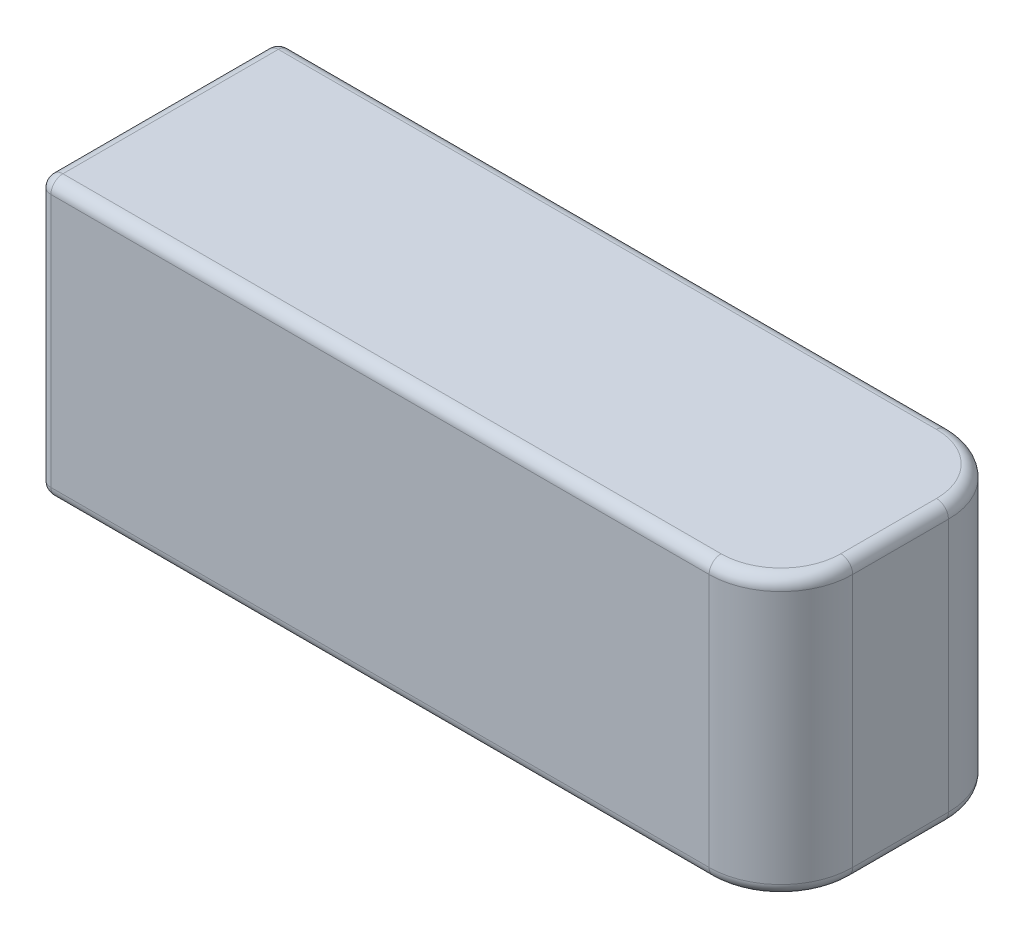
ISO-10303-21;
HEADER;
FILE_DESCRIPTION(('STEP AP214'),'2;1');
FILE_NAME('part.step','',(''),(''),'','','');
FILE_SCHEMA(('AUTOMOTIVE_DESIGN { 1 0 10303 214 1 1 1 1 }'));
ENDSEC;
DATA;
#1=APPLICATION_CONTEXT('core data for automotive mechanical design processes');
#2=APPLICATION_PROTOCOL_DEFINITION('international standard','automotive_design',2000,#1);
#3=PRODUCT_CONTEXT('',#1,'mechanical');
#4=PRODUCT('Part','Part','',(#3));
#5=PRODUCT_RELATED_PRODUCT_CATEGORY('part','',(#4));
#6=PRODUCT_DEFINITION_FORMATION('','',#4);
#7=PRODUCT_DEFINITION_CONTEXT('part definition',#1,'design');
#8=PRODUCT_DEFINITION('design','',#6,#7);
#9=PRODUCT_DEFINITION_SHAPE('','',#8);
#10=(LENGTH_UNIT() NAMED_UNIT(*) SI_UNIT(.MILLI.,.METRE.));
#11=(NAMED_UNIT(*) PLANE_ANGLE_UNIT() SI_UNIT($,.RADIAN.));
#12=(NAMED_UNIT(*) SI_UNIT($,.STERADIAN.) SOLID_ANGLE_UNIT());
#13=UNCERTAINTY_MEASURE_WITH_UNIT(LENGTH_MEASURE(1.E-05),#10,'distance_accuracy_value','');
#14=(GEOMETRIC_REPRESENTATION_CONTEXT(3) GLOBAL_UNCERTAINTY_ASSIGNED_CONTEXT((#13)) GLOBAL_UNIT_ASSIGNED_CONTEXT((#10,
#11,#12)) REPRESENTATION_CONTEXT('',''));
#15=CARTESIAN_POINT('',(0.,0.,0.));
#16=DIRECTION('',(0.,0.,1.));
#17=DIRECTION('',(1.,0.,0.));
#18=AXIS2_PLACEMENT_3D('',#15,#16,#17);
#19=CARTESIAN_POINT('',(-77.5,58.,-25.));
#20=DIRECTION('',(1.,0.,0.));
#21=DIRECTION('',(0.,0.,-1.));
#22=AXIS2_PLACEMENT_3D('',#19,#20,#21);
#23=PLANE('',#22);
#24=DIRECTION('',(0.,0.,1.));
#25=VECTOR('',#24,1.);
#26=CARTESIAN_POINT('',(-77.5,2.5,-25.));
#27=LINE('',#26,#25);
#28=CARTESIAN_POINT('',(-77.5,2.5,-22.5));
#29=VERTEX_POINT('',#28);
#30=CARTESIAN_POINT('',(-77.5,2.5,22.5));
#31=VERTEX_POINT('',#30);
#32=EDGE_CURVE('E195',#29,#31,#27,.T.);
#33=ORIENTED_EDGE('',*,*,#32,.T.);
#34=DIRECTION('',(0.,-1.,0.));
#35=VECTOR('',#34,1.);
#36=CARTESIAN_POINT('',(-77.5,58.,22.5));
#37=LINE('',#36,#35);
#38=CARTESIAN_POINT('',(-77.5,55.5,22.5));
#39=VERTEX_POINT('',#38);
#40=EDGE_CURVE('E198',#31,#39,#37,.F.);
#41=ORIENTED_EDGE('',*,*,#40,.T.);
#42=DIRECTION('',(0.,0.,1.));
#43=VECTOR('',#42,1.);
#44=CARTESIAN_POINT('',(-77.5,55.5,-25.));
#45=LINE('',#44,#43);
#46=CARTESIAN_POINT('',(-77.5,55.5,-22.5));
#47=VERTEX_POINT('',#46);
#48=EDGE_CURVE('E160',#39,#47,#45,.F.);
#49=ORIENTED_EDGE('',*,*,#48,.T.);
#50=DIRECTION('',(0.,-1.,0.));
#51=VECTOR('',#50,1.);
#52=CARTESIAN_POINT('',(-77.5,58.,-22.5));
#53=LINE('',#52,#51);
#54=EDGE_CURVE('E193',#47,#29,#53,.T.);
#55=ORIENTED_EDGE('',*,*,#54,.T.);
#56=EDGE_LOOP('',(#33,#41,#49,#55));
#57=FACE_BOUND('',#56,.T.);
#58=ADVANCED_FACE('F43',(#57),#23,.F.);
#59=CARTESIAN_POINT('',(-77.5,58.,25.));
#60=DIRECTION('',(0.,0.,-1.));
#61=DIRECTION('',(-1.,0.,0.));
#62=AXIS2_PLACEMENT_3D('',#59,#60,#61);
#63=PLANE('',#62);
#64=DIRECTION('',(0.,-1.,0.));
#65=VECTOR('',#64,1.);
#66=CARTESIAN_POINT('',(62.5,58.,25.));
#67=LINE('',#66,#65);
#68=CARTESIAN_POINT('',(62.5,2.5,25.));
#69=VERTEX_POINT('',#68);
#70=CARTESIAN_POINT('',(62.5,55.5,25.));
#71=VERTEX_POINT('',#70);
#72=EDGE_CURVE('E176',#69,#71,#67,.F.);
#73=ORIENTED_EDGE('',*,*,#72,.T.);
#74=DIRECTION('',(1.,0.,0.));
#75=VECTOR('',#74,1.);
#76=CARTESIAN_POINT('',(-77.5,55.5,25.));
#77=LINE('',#76,#75);
#78=CARTESIAN_POINT('',(-75.,55.5,25.));
#79=VERTEX_POINT('',#78);
#80=EDGE_CURVE('E11',#71,#79,#77,.F.);
#81=ORIENTED_EDGE('',*,*,#80,.T.);
#82=DIRECTION('',(0.,-1.,0.));
#83=VECTOR('',#82,1.);
#84=CARTESIAN_POINT('',(-75.,58.,25.));
#85=LINE('',#84,#83);
#86=CARTESIAN_POINT('',(-75.,2.5,25.));
#87=VERTEX_POINT('',#86);
#88=EDGE_CURVE('E52',#79,#87,#85,.T.);
#89=ORIENTED_EDGE('',*,*,#88,.T.);
#90=DIRECTION('',(1.,0.,0.));
#91=VECTOR('',#90,1.);
#92=CARTESIAN_POINT('',(-77.5,2.5,25.));
#93=LINE('',#92,#91);
#94=EDGE_CURVE('E227',#87,#69,#93,.T.);
#95=ORIENTED_EDGE('',*,*,#94,.T.);
#96=EDGE_LOOP('',(#73,#81,#89,#95));
#97=FACE_BOUND('',#96,.T.);
#98=ADVANCED_FACE('F310',(#97),#63,.F.);
#99=CARTESIAN_POINT('',(77.5,58.,-25.));
#100=DIRECTION('',(-1.,0.,0.));
#101=DIRECTION('',(0.,0.,1.));
#102=AXIS2_PLACEMENT_3D('',#99,#100,#101);
#103=PLANE('',#102);
#104=DIRECTION('',(0.,-1.,0.));
#105=VECTOR('',#104,1.);
#106=CARTESIAN_POINT('',(77.5,58.,-10.));
#107=LINE('',#106,#105);
#108=CARTESIAN_POINT('',(77.5,2.5,-10.));
#109=VERTEX_POINT('',#108);
#110=CARTESIAN_POINT('',(77.5,55.5,-10.));
#111=VERTEX_POINT('',#110);
#112=EDGE_CURVE('E178',#109,#111,#107,.F.);
#113=ORIENTED_EDGE('',*,*,#112,.T.);
#114=DIRECTION('',(0.,0.,-1.));
#115=VECTOR('',#114,1.);
#116=CARTESIAN_POINT('',(77.5,55.5,9.99999999999999));
#117=LINE('',#116,#115);
#118=CARTESIAN_POINT('',(77.5,55.5,9.99999999999999));
#119=VERTEX_POINT('',#118);
#120=EDGE_CURVE('E212',#111,#119,#117,.F.);
#121=ORIENTED_EDGE('',*,*,#120,.T.);
#122=DIRECTION('',(0.,-1.,0.));
#123=VECTOR('',#122,1.);
#124=CARTESIAN_POINT('',(77.5,58.,9.99999999999999));
#125=LINE('',#124,#123);
#126=CARTESIAN_POINT('',(77.5,2.5,9.99999999999999));
#127=VERTEX_POINT('',#126);
#128=EDGE_CURVE('E280',#119,#127,#125,.T.);
#129=ORIENTED_EDGE('',*,*,#128,.T.);
#130=DIRECTION('',(0.,0.,-1.));
#131=VECTOR('',#130,1.);
#132=CARTESIAN_POINT('',(77.5,2.5,-25.));
#133=LINE('',#132,#131);
#134=EDGE_CURVE('E210',#127,#109,#133,.T.);
#135=ORIENTED_EDGE('',*,*,#134,.T.);
#136=EDGE_LOOP('',(#113,#121,#129,#135));
#137=FACE_BOUND('',#136,.T.);
#138=ADVANCED_FACE('F290',(#137),#103,.F.);
#139=CARTESIAN_POINT('',(-77.5,58.,-25.));
#140=DIRECTION('',(0.,0.,1.));
#141=DIRECTION('',(1.,0.,0.));
#142=AXIS2_PLACEMENT_3D('',#139,#140,#141);
#143=PLANE('',#142);
#144=DIRECTION('',(0.,-1.,0.));
#145=VECTOR('',#144,1.);
#146=CARTESIAN_POINT('',(-75.,58.,-25.));
#147=LINE('',#146,#145);
#148=CARTESIAN_POINT('',(-75.,2.5,-25.));
#149=VERTEX_POINT('',#148);
#150=CARTESIAN_POINT('',(-75.,55.5,-25.));
#151=VERTEX_POINT('',#150);
#152=EDGE_CURVE('E200',#149,#151,#147,.F.);
#153=ORIENTED_EDGE('',*,*,#152,.T.);
#154=DIRECTION('',(-1.,0.,0.));
#155=VECTOR('',#154,1.);
#156=CARTESIAN_POINT('',(62.5,55.5,-25.));
#157=LINE('',#156,#155);
#158=CARTESIAN_POINT('',(62.5,55.5,-25.));
#159=VERTEX_POINT('',#158);
#160=EDGE_CURVE('E204',#151,#159,#157,.F.);
#161=ORIENTED_EDGE('',*,*,#160,.T.);
#162=DIRECTION('',(0.,-1.,0.));
#163=VECTOR('',#162,1.);
#164=CARTESIAN_POINT('',(62.5,58.,-25.));
#165=LINE('',#164,#163);
#166=CARTESIAN_POINT('',(62.5,2.5,-25.));
#167=VERTEX_POINT('',#166);
#168=EDGE_CURVE('E274',#159,#167,#165,.T.);
#169=ORIENTED_EDGE('',*,*,#168,.T.);
#170=DIRECTION('',(-1.,0.,0.));
#171=VECTOR('',#170,1.);
#172=CARTESIAN_POINT('',(-77.5,2.5,-25.));
#173=LINE('',#172,#171);
#174=EDGE_CURVE('E202',#167,#149,#173,.T.);
#175=ORIENTED_EDGE('',*,*,#174,.T.);
#176=EDGE_LOOP('',(#153,#161,#169,#175));
#177=FACE_BOUND('',#176,.T.);
#178=ADVANCED_FACE('F523',(#177),#143,.F.);
#179=CARTESIAN_POINT('',(0.,58.,0.));
#180=DIRECTION('',(0.,1.,0.));
#181=DIRECTION('',(0.,0.,1.));
#182=AXIS2_PLACEMENT_3D('',#179,#180,#181);
#183=PLANE('',#182);
#184=CARTESIAN_POINT('',(62.5,58.,-10.));
#185=DIRECTION('',(0.,1.,0.));
#186=DIRECTION('',(0.,0.,1.));
#187=AXIS2_PLACEMENT_3D('',#184,#185,#186);
#188=CIRCLE('',#187,12.5);
#189=CARTESIAN_POINT('',(75.,58.,-10.));
#190=VERTEX_POINT('',#189);
#191=CARTESIAN_POINT('',(62.5,58.,-22.5));
#192=VERTEX_POINT('',#191);
#193=EDGE_CURVE('E185',#190,#192,#188,.T.);
#194=ORIENTED_EDGE('',*,*,#193,.T.);
#195=DIRECTION('',(-1.,0.,0.));
#196=VECTOR('',#195,1.);
#197=CARTESIAN_POINT('',(-77.5,58.,-22.5));
#198=LINE('',#197,#196);
#199=CARTESIAN_POINT('',(-75.,58.,-22.5));
#200=VERTEX_POINT('',#199);
#201=EDGE_CURVE('E149',#192,#200,#198,.T.);
#202=ORIENTED_EDGE('',*,*,#201,.T.);
#203=DIRECTION('',(0.,0.,1.));
#204=VECTOR('',#203,1.);
#205=CARTESIAN_POINT('',(-75.,58.,25.));
#206=LINE('',#205,#204);
#207=CARTESIAN_POINT('',(-75.,58.,22.5));
#208=VERTEX_POINT('',#207);
#209=EDGE_CURVE('E141',#200,#208,#206,.T.);
#210=ORIENTED_EDGE('',*,*,#209,.T.);
#211=DIRECTION('',(1.,0.,0.));
#212=VECTOR('',#211,1.);
#213=CARTESIAN_POINT('',(62.5,58.,22.5));
#214=LINE('',#213,#212);
#215=CARTESIAN_POINT('',(62.5,58.,22.5));
#216=VERTEX_POINT('',#215);
#217=EDGE_CURVE('E146',#208,#216,#214,.T.);
#218=ORIENTED_EDGE('',*,*,#217,.T.);
#219=CARTESIAN_POINT('',(62.5,58.,9.99999999999999));
#220=DIRECTION('',(0.,1.,0.));
#221=DIRECTION('',(0.,0.,1.));
#222=AXIS2_PLACEMENT_3D('',#219,#220,#221);
#223=CIRCLE('',#222,12.5);
#224=CARTESIAN_POINT('',(75.,58.,9.99999999999999));
#225=VERTEX_POINT('',#224);
#226=EDGE_CURVE('E152',#216,#225,#223,.T.);
#227=ORIENTED_EDGE('',*,*,#226,.T.);
#228=DIRECTION('',(0.,0.,-1.));
#229=VECTOR('',#228,1.);
#230=CARTESIAN_POINT('',(75.,58.,-10.));
#231=LINE('',#230,#229);
#232=EDGE_CURVE('E183',#225,#190,#231,.T.);
#233=ORIENTED_EDGE('',*,*,#232,.T.);
#234=EDGE_LOOP('',(#194,#202,#210,#218,#227,#233));
#235=FACE_BOUND('',#234,.T.);
#236=ADVANCED_FACE('F143',(#235),#183,.T.);
#237=CARTESIAN_POINT('',(0.,0.,0.));
#238=DIRECTION('',(0.,1.,0.));
#239=DIRECTION('',(0.,0.,1.));
#240=AXIS2_PLACEMENT_3D('',#237,#238,#239);
#241=PLANE('',#240);
#242=CARTESIAN_POINT('',(62.5,0.,-10.));
#243=DIRECTION('',(0.,1.,0.));
#244=DIRECTION('',(0.,0.,1.));
#245=AXIS2_PLACEMENT_3D('',#242,#243,#244);
#246=CIRCLE('',#245,12.5);
#247=CARTESIAN_POINT('',(62.5,0.,-22.5));
#248=VERTEX_POINT('',#247);
#249=CARTESIAN_POINT('',(75.,0.,-10.));
#250=VERTEX_POINT('',#249);
#251=EDGE_CURVE('E223',#248,#250,#246,.F.);
#252=ORIENTED_EDGE('',*,*,#251,.T.);
#253=DIRECTION('',(0.,0.,-1.));
#254=VECTOR('',#253,1.);
#255=CARTESIAN_POINT('',(75.,0.,0.));
#256=LINE('',#255,#254);
#257=CARTESIAN_POINT('',(75.,0.,9.99999999999999));
#258=VERTEX_POINT('',#257);
#259=EDGE_CURVE('E225',#250,#258,#256,.F.);
#260=ORIENTED_EDGE('',*,*,#259,.T.);
#261=CARTESIAN_POINT('',(62.5,0.,9.99999999999999));
#262=DIRECTION('',(0.,1.,0.));
#263=DIRECTION('',(0.,0.,1.));
#264=AXIS2_PLACEMENT_3D('',#261,#262,#263);
#265=CIRCLE('',#264,12.5);
#266=CARTESIAN_POINT('',(62.5,0.,22.5));
#267=VERTEX_POINT('',#266);
#268=EDGE_CURVE('E216',#258,#267,#265,.F.);
#269=ORIENTED_EDGE('',*,*,#268,.T.);
#270=DIRECTION('',(1.,0.,0.));
#271=VECTOR('',#270,1.);
#272=CARTESIAN_POINT('',(0.,0.,22.5));
#273=LINE('',#272,#271);
#274=CARTESIAN_POINT('',(-75.,0.,22.5));
#275=VERTEX_POINT('',#274);
#276=EDGE_CURVE('E214',#267,#275,#273,.F.);
#277=ORIENTED_EDGE('',*,*,#276,.T.);
#278=DIRECTION('',(0.,0.,1.));
#279=VECTOR('',#278,1.);
#280=CARTESIAN_POINT('',(-75.,0.,0.));
#281=LINE('',#280,#279);
#282=CARTESIAN_POINT('',(-75.,0.,-22.5));
#283=VERTEX_POINT('',#282);
#284=EDGE_CURVE('E218',#275,#283,#281,.F.);
#285=ORIENTED_EDGE('',*,*,#284,.T.);
#286=DIRECTION('',(-1.,0.,0.));
#287=VECTOR('',#286,1.);
#288=CARTESIAN_POINT('',(0.,0.,-22.5));
#289=LINE('',#288,#287);
#290=EDGE_CURVE('E221',#283,#248,#289,.F.);
#291=ORIENTED_EDGE('',*,*,#290,.T.);
#292=EDGE_LOOP('',(#252,#260,#269,#277,#285,#291));
#293=FACE_BOUND('',#292,.T.);
#294=ADVANCED_FACE('F331',(#293),#241,.F.);
#295=CARTESIAN_POINT('',(62.5,58.,-10.));
#296=DIRECTION('',(0.,-1.,0.));
#297=DIRECTION('',(0.,0.,-1.));
#298=AXIS2_PLACEMENT_3D('',#295,#296,#297);
#299=CYLINDRICAL_SURFACE('',#298,15.);
#300=ORIENTED_EDGE('',*,*,#168,.F.);
#301=CARTESIAN_POINT('',(62.5,55.5,-10.));
#302=DIRECTION('',(0.,1.,0.));
#303=DIRECTION('',(0.,0.,1.));
#304=AXIS2_PLACEMENT_3D('',#301,#302,#303);
#305=CIRCLE('',#304,15.);
#306=EDGE_CURVE('E208',#159,#111,#305,.F.);
#307=ORIENTED_EDGE('',*,*,#306,.T.);
#308=ORIENTED_EDGE('',*,*,#112,.F.);
#309=CARTESIAN_POINT('',(62.5,2.5,-10.));
#310=DIRECTION('',(0.,1.,0.));
#311=DIRECTION('',(0.,0.,1.));
#312=AXIS2_PLACEMENT_3D('',#309,#310,#311);
#313=CIRCLE('',#312,15.);
#314=EDGE_CURVE('E206',#109,#167,#313,.T.);
#315=ORIENTED_EDGE('',*,*,#314,.T.);
#316=EDGE_LOOP('',(#300,#307,#308,#315));
#317=FACE_BOUND('',#316,.T.);
#318=ADVANCED_FACE('F354',(#317),#299,.T.);
#319=CARTESIAN_POINT('',(62.5,58.,9.99999999999999));
#320=DIRECTION('',(0.,-1.,0.));
#321=DIRECTION('',(0.,0.,-1.));
#322=AXIS2_PLACEMENT_3D('',#319,#320,#321);
#323=CYLINDRICAL_SURFACE('',#322,15.);
#324=ORIENTED_EDGE('',*,*,#128,.F.);
#325=CARTESIAN_POINT('',(62.5,55.5,9.99999999999999));
#326=DIRECTION('',(0.,1.,0.));
#327=DIRECTION('',(0.,0.,1.));
#328=AXIS2_PLACEMENT_3D('',#325,#326,#327);
#329=CIRCLE('',#328,15.);
#330=EDGE_CURVE('E190',#119,#71,#329,.F.);
#331=ORIENTED_EDGE('',*,*,#330,.T.);
#332=ORIENTED_EDGE('',*,*,#72,.F.);
#333=CARTESIAN_POINT('',(62.5,2.5,9.99999999999999));
#334=DIRECTION('',(0.,1.,0.));
#335=DIRECTION('',(0.,0.,1.));
#336=AXIS2_PLACEMENT_3D('',#333,#334,#335);
#337=CIRCLE('',#336,15.);
#338=EDGE_CURVE('E188',#69,#127,#337,.T.);
#339=ORIENTED_EDGE('',*,*,#338,.T.);
#340=EDGE_LOOP('',(#324,#331,#332,#339));
#341=FACE_BOUND('',#340,.T.);
#342=ADVANCED_FACE('F308',(#341),#323,.T.);
#343=CARTESIAN_POINT('',(62.5,2.5,-10.));
#344=DIRECTION('',(0.,1.,0.));
#345=DIRECTION('',(0.,0.,1.));
#346=AXIS2_PLACEMENT_3D('',#343,#344,#345);
#347=TOROIDAL_SURFACE('',#346,12.5,2.5);
#348=CARTESIAN_POINT('',(62.5,2.5,-22.5));
#349=DIRECTION('',(-1.,0.,0.));
#350=DIRECTION('',(0.,0.,1.));
#351=AXIS2_PLACEMENT_3D('',#348,#349,#350);
#352=CIRCLE('',#351,2.5);
#353=EDGE_CURVE('E267',#167,#248,#352,.T.);
#354=ORIENTED_EDGE('',*,*,#353,.F.);
#355=ORIENTED_EDGE('',*,*,#314,.F.);
#356=CARTESIAN_POINT('',(75.,2.5,-10.));
#357=DIRECTION('',(0.,0.,1.));
#358=DIRECTION('',(1.,0.,0.));
#359=AXIS2_PLACEMENT_3D('',#356,#357,#358);
#360=CIRCLE('',#359,2.5);
#361=EDGE_CURVE('E47',#250,#109,#360,.T.);
#362=ORIENTED_EDGE('',*,*,#361,.F.);
#363=ORIENTED_EDGE('',*,*,#251,.F.);
#364=EDGE_LOOP('',(#354,#355,#362,#363));
#365=FACE_BOUND('',#364,.T.);
#366=ADVANCED_FACE('F45',(#365),#347,.T.);
#367=CARTESIAN_POINT('',(75.,2.5,-25.));
#368=DIRECTION('',(0.,0.,-1.));
#369=DIRECTION('',(-1.,0.,0.));
#370=AXIS2_PLACEMENT_3D('',#367,#368,#369);
#371=CYLINDRICAL_SURFACE('',#370,2.5);
#372=ORIENTED_EDGE('',*,*,#361,.T.);
#373=ORIENTED_EDGE('',*,*,#134,.F.);
#374=CARTESIAN_POINT('',(75.,2.5,9.99999999999999));
#375=DIRECTION('',(0.,0.,1.));
#376=DIRECTION('',(1.,0.,0.));
#377=AXIS2_PLACEMENT_3D('',#374,#375,#376);
#378=CIRCLE('',#377,2.5);
#379=EDGE_CURVE('E265',#258,#127,#378,.T.);
#380=ORIENTED_EDGE('',*,*,#379,.F.);
#381=ORIENTED_EDGE('',*,*,#259,.F.);
#382=EDGE_LOOP('',(#372,#373,#380,#381));
#383=FACE_BOUND('',#382,.T.);
#384=ADVANCED_FACE('F337',(#383),#371,.T.);
#385=CARTESIAN_POINT('',(-77.5,2.5,-22.5));
#386=DIRECTION('',(-1.,0.,0.));
#387=DIRECTION('',(0.,0.,1.));
#388=AXIS2_PLACEMENT_3D('',#385,#386,#387);
#389=CYLINDRICAL_SURFACE('',#388,2.5);
#390=ORIENTED_EDGE('',*,*,#353,.T.);
#391=ORIENTED_EDGE('',*,*,#290,.F.);
#392=CARTESIAN_POINT('',(-75.,2.5,-22.5));
#393=DIRECTION('',(-1.,0.,0.));
#394=DIRECTION('',(0.,0.,1.));
#395=AXIS2_PLACEMENT_3D('',#392,#393,#394);
#396=CIRCLE('',#395,2.5);
#397=EDGE_CURVE('E262',#149,#283,#396,.T.);
#398=ORIENTED_EDGE('',*,*,#397,.F.);
#399=ORIENTED_EDGE('',*,*,#174,.F.);
#400=EDGE_LOOP('',(#390,#391,#398,#399));
#401=FACE_BOUND('',#400,.T.);
#402=ADVANCED_FACE('F339',(#401),#389,.T.);
#403=CARTESIAN_POINT('',(62.5,2.5,9.99999999999999));
#404=DIRECTION('',(0.,1.,0.));
#405=DIRECTION('',(0.,0.,1.));
#406=AXIS2_PLACEMENT_3D('',#403,#404,#405);
#407=TOROIDAL_SURFACE('',#406,12.5,2.5);
#408=ORIENTED_EDGE('',*,*,#379,.T.);
#409=ORIENTED_EDGE('',*,*,#338,.F.);
#410=CARTESIAN_POINT('',(62.5,2.5,22.5));
#411=DIRECTION('',(-1.,0.,0.));
#412=DIRECTION('',(0.,0.,1.));
#413=AXIS2_PLACEMENT_3D('',#410,#411,#412);
#414=CIRCLE('',#413,2.5);
#415=EDGE_CURVE('E259',#267,#69,#414,.T.);
#416=ORIENTED_EDGE('',*,*,#415,.F.);
#417=ORIENTED_EDGE('',*,*,#268,.F.);
#418=EDGE_LOOP('',(#408,#409,#416,#417));
#419=FACE_BOUND('',#418,.T.);
#420=ADVANCED_FACE('F336',(#419),#407,.T.);
#421=CARTESIAN_POINT('',(-75.,2.5,-22.5));
#422=DIRECTION('',(0.,-1.,0.));
#423=DIRECTION('',(0.,0.,-1.));
#424=AXIS2_PLACEMENT_3D('',#421,#422,#423);
#425=SPHERICAL_SURFACE('',#424,2.5);
#426=CARTESIAN_POINT('',(-75.,2.5,-22.5));
#427=DIRECTION('',(0.,-1.,0.));
#428=DIRECTION('',(0.,0.,-1.));
#429=AXIS2_PLACEMENT_3D('',#426,#427,#428);
#430=CIRCLE('',#429,2.5);
#431=EDGE_CURVE('E254',#149,#29,#430,.F.);
#432=ORIENTED_EDGE('',*,*,#431,.F.);
#433=ORIENTED_EDGE('',*,*,#397,.T.);
#434=CARTESIAN_POINT('',(-75.,2.5,-22.5));
#435=DIRECTION('',(0.,0.,-1.));
#436=DIRECTION('',(-1.,0.,0.));
#437=AXIS2_PLACEMENT_3D('',#434,#435,#436);
#438=CIRCLE('',#437,2.5);
#439=EDGE_CURVE('E257',#29,#283,#438,.F.);
#440=ORIENTED_EDGE('',*,*,#439,.F.);
#441=EDGE_LOOP('',(#432,#433,#440));
#442=FACE_BOUND('',#441,.T.);
#443=ADVANCED_FACE('F391',(#442),#425,.T.);
#444=CARTESIAN_POINT('',(-77.5,2.5,22.5));
#445=DIRECTION('',(1.,0.,0.));
#446=DIRECTION('',(0.,0.,-1.));
#447=AXIS2_PLACEMENT_3D('',#444,#445,#446);
#448=CYLINDRICAL_SURFACE('',#447,2.5);
#449=ORIENTED_EDGE('',*,*,#415,.T.);
#450=ORIENTED_EDGE('',*,*,#94,.F.);
#451=CARTESIAN_POINT('',(-75.,2.5,22.5));
#452=DIRECTION('',(-1.,0.,0.));
#453=DIRECTION('',(0.,0.,1.));
#454=AXIS2_PLACEMENT_3D('',#451,#452,#453);
#455=CIRCLE('',#454,2.5);
#456=EDGE_CURVE('E251',#275,#87,#455,.T.);
#457=ORIENTED_EDGE('',*,*,#456,.F.);
#458=ORIENTED_EDGE('',*,*,#276,.F.);
#459=EDGE_LOOP('',(#449,#450,#457,#458));
#460=FACE_BOUND('',#459,.T.);
#461=ADVANCED_FACE('F313',(#460),#448,.T.);
#462=CARTESIAN_POINT('',(-75.,2.5,-25.));
#463=DIRECTION('',(0.,0.,1.));
#464=DIRECTION('',(1.,0.,0.));
#465=AXIS2_PLACEMENT_3D('',#462,#463,#464);
#466=CYLINDRICAL_SURFACE('',#465,2.5);
#467=ORIENTED_EDGE('',*,*,#439,.T.);
#468=ORIENTED_EDGE('',*,*,#284,.F.);
#469=CARTESIAN_POINT('',(-75.,2.5,22.5));
#470=DIRECTION('',(0.,0.,1.));
#471=DIRECTION('',(1.,0.,0.));
#472=AXIS2_PLACEMENT_3D('',#469,#470,#471);
#473=CIRCLE('',#472,2.5);
#474=EDGE_CURVE('E248',#31,#275,#473,.T.);
#475=ORIENTED_EDGE('',*,*,#474,.F.);
#476=ORIENTED_EDGE('',*,*,#32,.F.);
#477=EDGE_LOOP('',(#467,#468,#475,#476));
#478=FACE_BOUND('',#477,.T.);
#479=ADVANCED_FACE('F328',(#478),#466,.T.);
#480=CARTESIAN_POINT('',(-75.,58.,-22.5));
#481=DIRECTION('',(0.,-1.,0.));
#482=DIRECTION('',(0.,0.,-1.));
#483=AXIS2_PLACEMENT_3D('',#480,#481,#482);
#484=CYLINDRICAL_SURFACE('',#483,2.5);
#485=ORIENTED_EDGE('',*,*,#431,.T.);
#486=ORIENTED_EDGE('',*,*,#54,.F.);
#487=CARTESIAN_POINT('',(-75.,55.5,-22.5));
#488=DIRECTION('',(0.,1.,0.));
#489=DIRECTION('',(0.,0.,1.));
#490=AXIS2_PLACEMENT_3D('',#487,#488,#489);
#491=CIRCLE('',#490,2.5);
#492=EDGE_CURVE('E245',#151,#47,#491,.T.);
#493=ORIENTED_EDGE('',*,*,#492,.F.);
#494=ORIENTED_EDGE('',*,*,#152,.F.);
#495=EDGE_LOOP('',(#485,#486,#493,#494));
#496=FACE_BOUND('',#495,.T.);
#497=ADVANCED_FACE('F383',(#496),#484,.T.);
#498=CARTESIAN_POINT('',(-75.,2.5,22.5));
#499=DIRECTION('',(0.,-1.,0.));
#500=DIRECTION('',(0.,0.,-1.));
#501=AXIS2_PLACEMENT_3D('',#498,#499,#500);
#502=SPHERICAL_SURFACE('',#501,2.5);
#503=ORIENTED_EDGE('',*,*,#474,.T.);
#504=ORIENTED_EDGE('',*,*,#456,.T.);
#505=CARTESIAN_POINT('',(-75.,2.5,22.5));
#506=DIRECTION('',(0.,-1.,0.));
#507=DIRECTION('',(0.,0.,-1.));
#508=AXIS2_PLACEMENT_3D('',#505,#506,#507);
#509=CIRCLE('',#508,2.5);
#510=EDGE_CURVE('E242',#31,#87,#509,.F.);
#511=ORIENTED_EDGE('',*,*,#510,.F.);
#512=EDGE_LOOP('',(#503,#504,#511));
#513=FACE_BOUND('',#512,.T.);
#514=ADVANCED_FACE('F318',(#513),#502,.T.);
#515=CARTESIAN_POINT('',(-75.,55.5,-22.5));
#516=DIRECTION('',(-1.,0.,0.));
#517=DIRECTION('',(0.,0.,1.));
#518=AXIS2_PLACEMENT_3D('',#515,#516,#517);
#519=SPHERICAL_SURFACE('',#518,2.5);
#520=CARTESIAN_POINT('',(-75.,55.5,-22.5));
#521=DIRECTION('',(-1.,0.,0.));
#522=DIRECTION('',(0.,0.,1.));
#523=AXIS2_PLACEMENT_3D('',#520,#521,#522);
#524=CIRCLE('',#523,2.5);
#525=EDGE_CURVE('E238',#151,#200,#524,.F.);
#526=ORIENTED_EDGE('',*,*,#525,.F.);
#527=ORIENTED_EDGE('',*,*,#492,.T.);
#528=CARTESIAN_POINT('',(-75.,55.5,-22.5));
#529=DIRECTION('',(0.,0.,-1.));
#530=DIRECTION('',(-1.,0.,0.));
#531=AXIS2_PLACEMENT_3D('',#528,#529,#530);
#532=CIRCLE('',#531,2.5);
#533=EDGE_CURVE('E240',#200,#47,#532,.F.);
#534=ORIENTED_EDGE('',*,*,#533,.F.);
#535=EDGE_LOOP('',(#526,#527,#534));
#536=FACE_BOUND('',#535,.T.);
#537=ADVANCED_FACE('F377',(#536),#519,.T.);
#538=CARTESIAN_POINT('',(-75.,58.,22.5));
#539=DIRECTION('',(0.,-1.,0.));
#540=DIRECTION('',(0.,0.,-1.));
#541=AXIS2_PLACEMENT_3D('',#538,#539,#540);
#542=CYLINDRICAL_SURFACE('',#541,2.5);
#543=ORIENTED_EDGE('',*,*,#510,.T.);
#544=ORIENTED_EDGE('',*,*,#88,.F.);
#545=CARTESIAN_POINT('',(-75.,55.5,22.5));
#546=DIRECTION('',(0.,1.,0.));
#547=DIRECTION('',(0.,0.,1.));
#548=AXIS2_PLACEMENT_3D('',#545,#546,#547);
#549=CIRCLE('',#548,2.5);
#550=EDGE_CURVE('E164',#39,#79,#549,.T.);
#551=ORIENTED_EDGE('',*,*,#550,.F.);
#552=ORIENTED_EDGE('',*,*,#40,.F.);
#553=EDGE_LOOP('',(#543,#544,#551,#552));
#554=FACE_BOUND('',#553,.T.);
#555=ADVANCED_FACE('F322',(#554),#542,.T.);
#556=CARTESIAN_POINT('',(-75.,55.5,0.));
#557=DIRECTION('',(0.,0.,-1.));
#558=DIRECTION('',(-1.,0.,0.));
#559=AXIS2_PLACEMENT_3D('',#556,#557,#558);
#560=CYLINDRICAL_SURFACE('',#559,2.5);
#561=ORIENTED_EDGE('',*,*,#533,.T.);
#562=ORIENTED_EDGE('',*,*,#48,.F.);
#563=CARTESIAN_POINT('',(-75.,55.5,22.5));
#564=DIRECTION('',(0.,0.,1.));
#565=DIRECTION('',(1.,0.,0.));
#566=AXIS2_PLACEMENT_3D('',#563,#564,#565);
#567=CIRCLE('',#566,2.5);
#568=EDGE_CURVE('E156',#208,#39,#567,.T.);
#569=ORIENTED_EDGE('',*,*,#568,.F.);
#570=ORIENTED_EDGE('',*,*,#209,.F.);
#571=EDGE_LOOP('',(#561,#562,#569,#570));
#572=FACE_BOUND('',#571,.T.);
#573=ADVANCED_FACE('F158',(#572),#560,.T.);
#574=CARTESIAN_POINT('',(0.,55.5,-22.5));
#575=DIRECTION('',(1.,0.,0.));
#576=DIRECTION('',(0.,0.,-1.));
#577=AXIS2_PLACEMENT_3D('',#574,#575,#576);
#578=CYLINDRICAL_SURFACE('',#577,2.5);
#579=ORIENTED_EDGE('',*,*,#525,.T.);
#580=ORIENTED_EDGE('',*,*,#201,.F.);
#581=CARTESIAN_POINT('',(62.5,55.5,-22.5));
#582=DIRECTION('',(1.,0.,0.));
#583=DIRECTION('',(0.,0.,-1.));
#584=AXIS2_PLACEMENT_3D('',#581,#582,#583);
#585=CIRCLE('',#584,2.5);
#586=EDGE_CURVE('E165',#159,#192,#585,.T.);
#587=ORIENTED_EDGE('',*,*,#586,.F.);
#588=ORIENTED_EDGE('',*,*,#160,.F.);
#589=EDGE_LOOP('',(#579,#580,#587,#588));
#590=FACE_BOUND('',#589,.T.);
#591=ADVANCED_FACE('F369',(#590),#578,.T.);
#592=CARTESIAN_POINT('',(-75.,55.5,22.5));
#593=DIRECTION('',(-1.,0.,0.));
#594=DIRECTION('',(0.,0.,1.));
#595=AXIS2_PLACEMENT_3D('',#592,#593,#594);
#596=SPHERICAL_SURFACE('',#595,2.5);
#597=ORIENTED_EDGE('',*,*,#568,.T.);
#598=ORIENTED_EDGE('',*,*,#550,.T.);
#599=CARTESIAN_POINT('',(-75.,55.5,22.5));
#600=DIRECTION('',(-1.,0.,0.));
#601=DIRECTION('',(0.,0.,1.));
#602=AXIS2_PLACEMENT_3D('',#599,#600,#601);
#603=CIRCLE('',#602,2.5);
#604=EDGE_CURVE('E168',#208,#79,#603,.F.);
#605=ORIENTED_EDGE('',*,*,#604,.F.);
#606=EDGE_LOOP('',(#597,#598,#605));
#607=FACE_BOUND('',#606,.T.);
#608=ADVANCED_FACE('F169',(#607),#596,.T.);
#609=CARTESIAN_POINT('',(62.5,55.5,-10.));
#610=DIRECTION('',(0.,1.,0.));
#611=DIRECTION('',(0.,0.,1.));
#612=AXIS2_PLACEMENT_3D('',#609,#610,#611);
#613=TOROIDAL_SURFACE('',#612,12.5,2.5);
#614=ORIENTED_EDGE('',*,*,#586,.T.);
#615=ORIENTED_EDGE('',*,*,#193,.F.);
#616=CARTESIAN_POINT('',(75.,55.5,-10.));
#617=DIRECTION('',(0.,0.,1.));
#618=DIRECTION('',(1.,0.,0.));
#619=AXIS2_PLACEMENT_3D('',#616,#617,#618);
#620=CIRCLE('',#619,2.5);
#621=EDGE_CURVE('E171',#111,#190,#620,.T.);
#622=ORIENTED_EDGE('',*,*,#621,.F.);
#623=ORIENTED_EDGE('',*,*,#306,.F.);
#624=EDGE_LOOP('',(#614,#615,#622,#623));
#625=FACE_BOUND('',#624,.T.);
#626=ADVANCED_FACE('F298',(#625),#613,.T.);
#627=CARTESIAN_POINT('',(0.,55.5,22.5));
#628=DIRECTION('',(-1.,0.,0.));
#629=DIRECTION('',(0.,0.,1.));
#630=AXIS2_PLACEMENT_3D('',#627,#628,#629);
#631=CYLINDRICAL_SURFACE('',#630,2.5);
#632=ORIENTED_EDGE('',*,*,#604,.T.);
#633=ORIENTED_EDGE('',*,*,#80,.F.);
#634=CARTESIAN_POINT('',(62.5,55.5,22.5));
#635=DIRECTION('',(1.,0.,0.));
#636=DIRECTION('',(0.,0.,-1.));
#637=AXIS2_PLACEMENT_3D('',#634,#635,#636);
#638=CIRCLE('',#637,2.5);
#639=EDGE_CURVE('E174',#216,#71,#638,.T.);
#640=ORIENTED_EDGE('',*,*,#639,.F.);
#641=ORIENTED_EDGE('',*,*,#217,.F.);
#642=EDGE_LOOP('',(#632,#633,#640,#641));
#643=FACE_BOUND('',#642,.T.);
#644=ADVANCED_FACE('F173',(#643),#631,.T.);
#645=CARTESIAN_POINT('',(75.,55.5,0.));
#646=DIRECTION('',(0.,0.,1.));
#647=DIRECTION('',(1.,0.,0.));
#648=AXIS2_PLACEMENT_3D('',#645,#646,#647);
#649=CYLINDRICAL_SURFACE('',#648,2.5);
#650=ORIENTED_EDGE('',*,*,#621,.T.);
#651=ORIENTED_EDGE('',*,*,#232,.F.);
#652=CARTESIAN_POINT('',(75.,55.5,9.99999999999999));
#653=DIRECTION('',(0.,0.,1.));
#654=DIRECTION('',(1.,0.,0.));
#655=AXIS2_PLACEMENT_3D('',#652,#653,#654);
#656=CIRCLE('',#655,2.5);
#657=EDGE_CURVE('E230',#119,#225,#656,.T.);
#658=ORIENTED_EDGE('',*,*,#657,.F.);
#659=ORIENTED_EDGE('',*,*,#120,.F.);
#660=EDGE_LOOP('',(#650,#651,#658,#659));
#661=FACE_BOUND('',#660,.T.);
#662=ADVANCED_FACE('F302',(#661),#649,.T.);
#663=CARTESIAN_POINT('',(62.5,55.5,9.99999999999999));
#664=DIRECTION('',(0.,1.,0.));
#665=DIRECTION('',(0.,0.,1.));
#666=AXIS2_PLACEMENT_3D('',#663,#664,#665);
#667=TOROIDAL_SURFACE('',#666,12.5,2.5);
#668=ORIENTED_EDGE('',*,*,#639,.T.);
#669=ORIENTED_EDGE('',*,*,#330,.F.);
#670=ORIENTED_EDGE('',*,*,#657,.T.);
#671=ORIENTED_EDGE('',*,*,#226,.F.);
#672=EDGE_LOOP('',(#668,#669,#670,#671));
#673=FACE_BOUND('',#672,.T.);
#674=ADVANCED_FACE('F305',(#673),#667,.T.);
#675=CLOSED_SHELL('',(#58,#98,#138,#178,#236,#294,#318,#342,#366,#384,#402,#420,#443,#461,#479,
#497,#514,#537,#555,#573,#591,#608,#626,#644,#662,#674));
#676=MANIFOLD_SOLID_BREP('B2',#675);
#677=ADVANCED_BREP_SHAPE_REPRESENTATION('',(#18,#676),#14);
#678=SHAPE_DEFINITION_REPRESENTATION(#9,#677);
ENDSEC;
END-ISO-10303-21;
